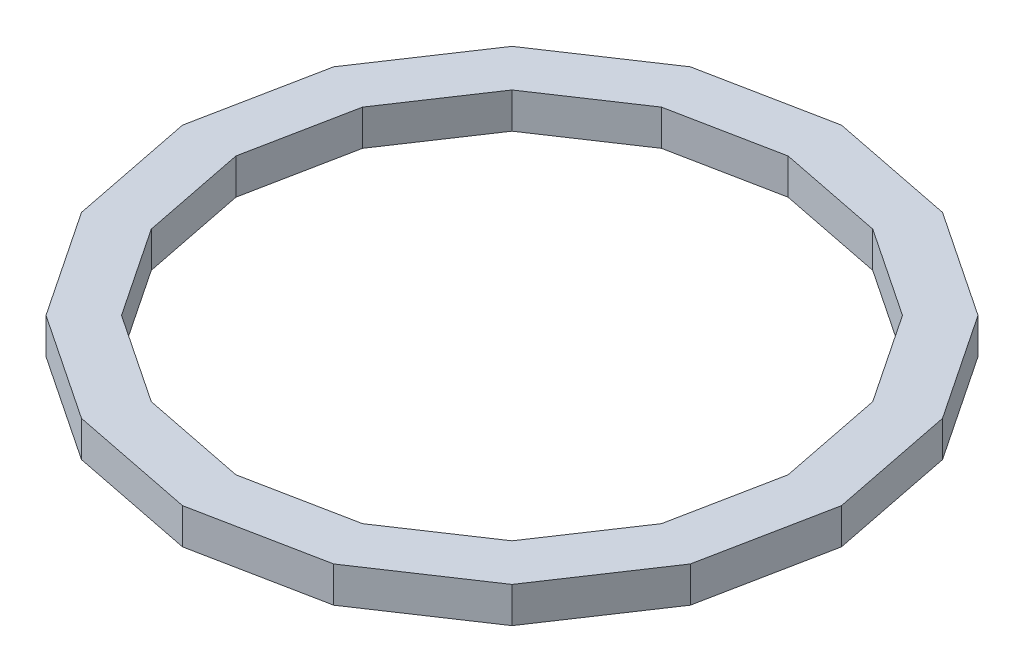
ISO-10303-21;
HEADER;
FILE_DESCRIPTION(('STEP AP214'),'2;1');
FILE_NAME('part.step','',(''),(''),'','','');
FILE_SCHEMA(('AUTOMOTIVE_DESIGN { 1 0 10303 214 1 1 1 1 }'));
ENDSEC;
DATA;
#1=APPLICATION_CONTEXT('core data for automotive mechanical design processes');
#2=APPLICATION_PROTOCOL_DEFINITION('international standard','automotive_design',2000,#1);
#3=PRODUCT_CONTEXT('',#1,'mechanical');
#4=PRODUCT('Part','Part','',(#3));
#5=PRODUCT_RELATED_PRODUCT_CATEGORY('part','',(#4));
#6=PRODUCT_DEFINITION_FORMATION('','',#4);
#7=PRODUCT_DEFINITION_CONTEXT('part definition',#1,'design');
#8=PRODUCT_DEFINITION('design','',#6,#7);
#9=PRODUCT_DEFINITION_SHAPE('','',#8);
#10=(LENGTH_UNIT() NAMED_UNIT(*) SI_UNIT(.MILLI.,.METRE.));
#11=(NAMED_UNIT(*) PLANE_ANGLE_UNIT() SI_UNIT($,.RADIAN.));
#12=(NAMED_UNIT(*) SI_UNIT($,.STERADIAN.) SOLID_ANGLE_UNIT());
#13=UNCERTAINTY_MEASURE_WITH_UNIT(LENGTH_MEASURE(1.E-05),#10,'distance_accuracy_value','');
#14=(GEOMETRIC_REPRESENTATION_CONTEXT(3) GLOBAL_UNCERTAINTY_ASSIGNED_CONTEXT((#13)) GLOBAL_UNIT_ASSIGNED_CONTEXT((#10,
#11,#12)) REPRESENTATION_CONTEXT('',''));
#15=CARTESIAN_POINT('',(0.,0.,0.));
#16=DIRECTION('',(0.,0.,1.));
#17=DIRECTION('',(1.,0.,0.));
#18=AXIS2_PLACEMENT_3D('',#15,#16,#17);
#19=CARTESIAN_POINT('',(0.,19.05,0.));
#20=DIRECTION('',(0.,1.,0.));
#21=DIRECTION('',(0.,0.,1.));
#22=AXIS2_PLACEMENT_3D('',#19,#20,#21);
#23=PLANE('',#22);
#24=DIRECTION('',(0.195090322016117,0.,-0.980785280403233));
#25=VECTOR('',#24,1.);
#26=CARTESIAN_POINT('',(162.385447122247,19.05,67.2622545300519));
#27=LINE('',#26,#25);
#28=CARTESIAN_POINT('',(162.385447122247,19.05,67.2622545300519));
#29=VERTEX_POINT('',#28);
#30=CARTESIAN_POINT('',(175.764741406113,19.05,-1.95677199495059E-12));
#31=VERTEX_POINT('',#30);
#32=EDGE_CURVE('E380',#29,#31,#27,.T.);
#33=ORIENTED_EDGE('',*,*,#32,.T.);
#34=DIRECTION('',(-0.195090322016139,0.,-0.980785280403228));
#35=VECTOR('',#34,1.);
#36=CARTESIAN_POINT('',(175.764741406113,19.05,-1.95677199495059E-12));
#37=LINE('',#36,#35);
#38=CARTESIAN_POINT('',(162.385447122246,19.05,-67.2622545300554));
#39=VERTEX_POINT('',#38);
#40=EDGE_CURVE('E384',#31,#39,#37,.T.);
#41=ORIENTED_EDGE('',*,*,#40,.T.);
#42=DIRECTION('',(-0.555570233019611,0.,-0.831469612302539));
#43=VECTOR('',#42,1.);
#44=CARTESIAN_POINT('',(162.385447122246,19.05,-67.2622545300554));
#45=LINE('',#44,#43);
#46=CARTESIAN_POINT('',(124.284440541761,19.05,-124.284440541764));
#47=VERTEX_POINT('',#46);
#48=EDGE_CURVE('E388',#39,#47,#45,.T.);
#49=ORIENTED_EDGE('',*,*,#48,.T.);
#50=DIRECTION('',(-0.831469612302552,0.,-0.555570233019593));
#51=VECTOR('',#50,1.);
#52=CARTESIAN_POINT('',(124.284440541761,19.05,-124.284440541764));
#53=LINE('',#52,#51);
#54=CARTESIAN_POINT('',(67.2622545300517,19.05,-162.385447122247));
#55=VERTEX_POINT('',#54);
#56=EDGE_CURVE('E390',#47,#55,#53,.T.);
#57=ORIENTED_EDGE('',*,*,#56,.T.);
#58=DIRECTION('',(-0.980785280403233,0.,-0.195090322016117));
#59=VECTOR('',#58,1.);
#60=CARTESIAN_POINT('',(67.2622545300517,19.05,-162.385447122247));
#61=LINE('',#60,#59);
#62=CARTESIAN_POINT('',(-1.95148982115408E-12,19.05,-175.764741406113));
#63=VERTEX_POINT('',#62);
#64=EDGE_CURVE('E393',#55,#63,#61,.T.);
#65=ORIENTED_EDGE('',*,*,#64,.T.);
#66=DIRECTION('',(-0.980785280403228,0.,0.195090322016139));
#67=VECTOR('',#66,1.);
#68=CARTESIAN_POINT('',(-1.95148982115408E-12,19.05,-175.764741406113));
#69=LINE('',#68,#67);
#70=CARTESIAN_POINT('',(-67.2622545300555,19.05,-162.385447122246));
#71=VERTEX_POINT('',#70);
#72=EDGE_CURVE('E395',#63,#71,#69,.T.);
#73=ORIENTED_EDGE('',*,*,#72,.T.);
#74=DIRECTION('',(-0.831469612302539,0.,0.555570233019612));
#75=VECTOR('',#74,1.);
#76=CARTESIAN_POINT('',(-67.2622545300555,19.05,-162.385447122246));
#77=LINE('',#76,#75);
#78=CARTESIAN_POINT('',(-124.284440541764,19.05,-124.284440541761));
#79=VERTEX_POINT('',#78);
#80=EDGE_CURVE('E398',#71,#79,#77,.T.);
#81=ORIENTED_EDGE('',*,*,#80,.T.);
#82=DIRECTION('',(-0.555570233019593,0.,0.831469612302551));
#83=VECTOR('',#82,1.);
#84=CARTESIAN_POINT('',(-124.284440541764,19.05,-124.284440541761));
#85=LINE('',#84,#83);
#86=CARTESIAN_POINT('',(-162.385447122247,19.05,-67.2622545300518));
#87=VERTEX_POINT('',#86);
#88=EDGE_CURVE('E401',#79,#87,#85,.T.);
#89=ORIENTED_EDGE('',*,*,#88,.T.);
#90=DIRECTION('',(-0.195090322016117,0.,0.980785280403233));
#91=VECTOR('',#90,1.);
#92=CARTESIAN_POINT('',(-162.385447122247,19.05,-67.2622545300518));
#93=LINE('',#92,#91);
#94=CARTESIAN_POINT('',(-175.764741406113,19.05,1.88137646251245E-12));
#95=VERTEX_POINT('',#94);
#96=EDGE_CURVE('E404',#87,#95,#93,.T.);
#97=ORIENTED_EDGE('',*,*,#96,.T.);
#98=DIRECTION('',(0.195090322016139,0.,0.980785280403228));
#99=VECTOR('',#98,1.);
#100=CARTESIAN_POINT('',(-175.764741406113,19.05,1.88137646251245E-12));
#101=LINE('',#100,#99);
#102=CARTESIAN_POINT('',(-162.385447122246,19.05,67.2622545300554));
#103=VERTEX_POINT('',#102);
#104=EDGE_CURVE('E407',#95,#103,#101,.T.);
#105=ORIENTED_EDGE('',*,*,#104,.T.);
#106=DIRECTION('',(0.555570233019612,0.,0.831469612302539));
#107=VECTOR('',#106,1.);
#108=CARTESIAN_POINT('',(-162.385447122246,19.05,67.2622545300554));
#109=LINE('',#108,#107);
#110=CARTESIAN_POINT('',(-124.284440541761,19.05,124.284440541764));
#111=VERTEX_POINT('',#110);
#112=EDGE_CURVE('E409',#103,#111,#109,.T.);
#113=ORIENTED_EDGE('',*,*,#112,.T.);
#114=DIRECTION('',(0.831469612302551,0.,0.555570233019593));
#115=VECTOR('',#114,1.);
#116=CARTESIAN_POINT('',(-124.284440541761,19.05,124.284440541764));
#117=LINE('',#116,#115);
#118=CARTESIAN_POINT('',(-67.2622545300519,19.05,162.385447122247));
#119=VERTEX_POINT('',#118);
#120=EDGE_CURVE('E411',#111,#119,#117,.T.);
#121=ORIENTED_EDGE('',*,*,#120,.T.);
#122=DIRECTION('',(0.980785280403233,0.,0.195090322016118));
#123=VECTOR('',#122,1.);
#124=CARTESIAN_POINT('',(-67.2622545300519,19.05,162.385447122247));
#125=LINE('',#124,#123);
#126=CARTESIAN_POINT('',(1.88663849847131E-12,19.05,175.764741406113));
#127=VERTEX_POINT('',#126);
#128=EDGE_CURVE('E414',#119,#127,#125,.T.);
#129=ORIENTED_EDGE('',*,*,#128,.T.);
#130=DIRECTION('',(0.980785280403228,0.,-0.195090322016139));
#131=VECTOR('',#130,1.);
#132=CARTESIAN_POINT('',(1.88663849847131E-12,19.05,175.764741406113));
#133=LINE('',#132,#131);
#134=CARTESIAN_POINT('',(67.2622545300554,19.05,162.385447122246));
#135=VERTEX_POINT('',#134);
#136=EDGE_CURVE('E416',#127,#135,#133,.T.);
#137=ORIENTED_EDGE('',*,*,#136,.T.);
#138=DIRECTION('',(0.831469612302539,0.,-0.555570233019612));
#139=VECTOR('',#138,1.);
#140=CARTESIAN_POINT('',(67.2622545300554,19.05,162.385447122246));
#141=LINE('',#140,#139);
#142=CARTESIAN_POINT('',(124.284440541764,19.05,124.284440541761));
#143=VERTEX_POINT('',#142);
#144=EDGE_CURVE('E418',#135,#143,#141,.T.);
#145=ORIENTED_EDGE('',*,*,#144,.T.);
#146=DIRECTION('',(0.555570233019593,0.,-0.831469612302551));
#147=VECTOR('',#146,1.);
#148=CARTESIAN_POINT('',(124.284440541764,19.05,124.284440541761));
#149=LINE('',#148,#147);
#150=EDGE_CURVE('E421',#143,#29,#149,.T.);
#151=ORIENTED_EDGE('',*,*,#150,.T.);
#152=EDGE_LOOP('',(#33,#41,#49,#57,#65,#73,#81,#89,#97,#105,#113,#121,#129,#137,#145,#151));
#153=FACE_BOUND('',#152,.T.);
#154=DIRECTION('',(-0.195090322016139,0.,-0.980785280403228));
#155=VECTOR('',#154,1.);
#156=CARTESIAN_POINT('',(147.277364445772,19.05,-1.77188747892797E-12));
#157=LINE('',#156,#155);
#158=CARTESIAN_POINT('',(147.277364445772,19.05,-1.77188747892797E-12));
#159=VERTEX_POINT('',#158);
#160=CARTESIAN_POINT('',(136.066542613654,19.05,-56.3606073357939));
#161=VERTEX_POINT('',#160);
#162=EDGE_CURVE('E252',#159,#161,#157,.T.);
#163=ORIENTED_EDGE('',*,*,#162,.F.);
#164=DIRECTION('',(0.195090322016117,0.,-0.980785280403233));
#165=VECTOR('',#164,1.);
#166=CARTESIAN_POINT('',(136.066542613655,19.05,56.3606073357909));
#167=LINE('',#166,#165);
#168=CARTESIAN_POINT('',(136.066542613655,19.05,56.3606073357909));
#169=VERTEX_POINT('',#168);
#170=EDGE_CURVE('E243',#169,#159,#167,.T.);
#171=ORIENTED_EDGE('',*,*,#170,.F.);
#172=DIRECTION('',(0.555570233019593,0.,-0.831469612302552));
#173=VECTOR('',#172,1.);
#174=CARTESIAN_POINT('',(104.140823114889,19.05,104.140823114887));
#175=LINE('',#174,#173);
#176=CARTESIAN_POINT('',(104.140823114889,19.05,104.140823114887));
#177=VERTEX_POINT('',#176);
#178=EDGE_CURVE('E300',#177,#169,#175,.T.);
#179=ORIENTED_EDGE('',*,*,#178,.F.);
#180=DIRECTION('',(0.831469612302539,0.,-0.555570233019611));
#181=VECTOR('',#180,1.);
#182=CARTESIAN_POINT('',(56.3606073357939,19.05,136.066542613654));
#183=LINE('',#182,#181);
#184=CARTESIAN_POINT('',(56.3606073357939,19.05,136.066542613654));
#185=VERTEX_POINT('',#184);
#186=EDGE_CURVE('E298',#185,#177,#183,.T.);
#187=ORIENTED_EDGE('',*,*,#186,.F.);
#188=DIRECTION('',(0.980785280403228,0.,-0.19509032201614));
#189=VECTOR('',#188,1.);
#190=CARTESIAN_POINT('',(1.68287399658217E-12,19.05,147.277364445772));
#191=LINE('',#190,#189);
#192=CARTESIAN_POINT('',(1.68287399658217E-12,19.05,147.277364445772));
#193=VERTEX_POINT('',#192);
#194=EDGE_CURVE('E296',#193,#185,#191,.T.);
#195=ORIENTED_EDGE('',*,*,#194,.F.);
#196=DIRECTION('',(0.980785280403233,0.,0.195090322016117));
#197=VECTOR('',#196,1.);
#198=CARTESIAN_POINT('',(-56.3606073357909,19.05,136.066542613655));
#199=LINE('',#198,#197);
#200=CARTESIAN_POINT('',(-56.3606073357909,19.05,136.066542613655));
#201=VERTEX_POINT('',#200);
#202=EDGE_CURVE('E294',#201,#193,#199,.T.);
#203=ORIENTED_EDGE('',*,*,#202,.F.);
#204=DIRECTION('',(0.831469612302551,0.,0.555570233019593));
#205=VECTOR('',#204,1.);
#206=CARTESIAN_POINT('',(-104.140823114887,19.05,104.140823114889));
#207=LINE('',#206,#205);
#208=CARTESIAN_POINT('',(-104.140823114887,19.05,104.140823114889));
#209=VERTEX_POINT('',#208);
#210=EDGE_CURVE('E292',#209,#201,#207,.T.);
#211=ORIENTED_EDGE('',*,*,#210,.F.);
#212=DIRECTION('',(0.555570233019612,0.,0.831469612302539));
#213=VECTOR('',#212,1.);
#214=CARTESIAN_POINT('',(-136.066542613654,19.05,56.3606073357939));
#215=LINE('',#214,#213);
#216=CARTESIAN_POINT('',(-136.066542613654,19.05,56.3606073357939));
#217=VERTEX_POINT('',#216);
#218=EDGE_CURVE('E290',#217,#209,#215,.T.);
#219=ORIENTED_EDGE('',*,*,#218,.F.);
#220=DIRECTION('',(0.195090322016139,0.,0.980785280403228));
#221=VECTOR('',#220,1.);
#222=CARTESIAN_POINT('',(-147.277364445772,19.05,1.6751924184933E-12));
#223=LINE('',#222,#221);
#224=CARTESIAN_POINT('',(-147.277364445772,19.05,1.6751924184933E-12));
#225=VERTEX_POINT('',#224);
#226=EDGE_CURVE('E288',#225,#217,#223,.T.);
#227=ORIENTED_EDGE('',*,*,#226,.F.);
#228=DIRECTION('',(-0.195090322016117,0.,0.980785280403233));
#229=VECTOR('',#228,1.);
#230=CARTESIAN_POINT('',(-136.066542613655,19.05,-56.3606073357908));
#231=LINE('',#230,#229);
#232=CARTESIAN_POINT('',(-136.066542613655,19.05,-56.3606073357908));
#233=VERTEX_POINT('',#232);
#234=EDGE_CURVE('E286',#233,#225,#231,.T.);
#235=ORIENTED_EDGE('',*,*,#234,.F.);
#236=DIRECTION('',(-0.555570233019593,0.,0.831469612302552));
#237=VECTOR('',#236,1.);
#238=CARTESIAN_POINT('',(-104.140823114889,19.05,-104.140823114887));
#239=LINE('',#238,#237);
#240=CARTESIAN_POINT('',(-104.140823114889,19.05,-104.140823114887));
#241=VERTEX_POINT('',#240);
#242=EDGE_CURVE('E283',#241,#233,#239,.T.);
#243=ORIENTED_EDGE('',*,*,#242,.F.);
#244=DIRECTION('',(-0.831469612302539,0.,0.555570233019612));
#245=VECTOR('',#244,1.);
#246=CARTESIAN_POINT('',(-56.3606073357939,19.05,-136.066542613654));
#247=LINE('',#246,#245);
#248=CARTESIAN_POINT('',(-56.3606073357939,19.05,-136.066542613654));
#249=VERTEX_POINT('',#248);
#250=EDGE_CURVE('E280',#249,#241,#247,.T.);
#251=ORIENTED_EDGE('',*,*,#250,.F.);
#252=DIRECTION('',(-0.980785280403228,0.,0.195090322016139));
#253=VECTOR('',#252,1.);
#254=CARTESIAN_POINT('',(-1.70092994275236E-12,19.05,-147.277364445772));
#255=LINE('',#254,#253);
#256=CARTESIAN_POINT('',(-1.70092994275236E-12,19.05,-147.277364445772));
#257=VERTEX_POINT('',#256);
#258=EDGE_CURVE('E278',#257,#249,#255,.T.);
#259=ORIENTED_EDGE('',*,*,#258,.F.);
#260=DIRECTION('',(-0.980785280403233,0.,-0.195090322016117));
#261=VECTOR('',#260,1.);
#262=CARTESIAN_POINT('',(56.360607335791,19.05,-136.066542613655));
#263=LINE('',#262,#261);
#264=CARTESIAN_POINT('',(56.360607335791,19.05,-136.066542613655));
#265=VERTEX_POINT('',#264);
#266=EDGE_CURVE('E275',#265,#257,#263,.T.);
#267=ORIENTED_EDGE('',*,*,#266,.F.);
#268=DIRECTION('',(-0.831469612302552,0.,-0.555570233019592));
#269=VECTOR('',#268,1.);
#270=CARTESIAN_POINT('',(104.140823114887,19.05,-104.140823114889));
#271=LINE('',#270,#269);
#272=CARTESIAN_POINT('',(104.140823114887,19.05,-104.140823114889));
#273=VERTEX_POINT('',#272);
#274=EDGE_CURVE('E271',#273,#265,#271,.T.);
#275=ORIENTED_EDGE('',*,*,#274,.F.);
#276=DIRECTION('',(-0.555570233019612,0.,-0.831469612302539));
#277=VECTOR('',#276,1.);
#278=CARTESIAN_POINT('',(136.066542613654,19.05,-56.3606073357939));
#279=LINE('',#278,#277);
#280=EDGE_CURVE('E265',#161,#273,#279,.T.);
#281=ORIENTED_EDGE('',*,*,#280,.F.);
#282=EDGE_LOOP('',(#163,#171,#179,#187,#195,#203,#211,#219,#227,#235,#243,#251,#259,#267,#275,#281));
#283=FACE_BOUND('',#282,.T.);
#284=ADVANCED_FACE('F34',(#153,#283),#23,.T.);
#285=CARTESIAN_POINT('',(0.,0.,0.));
#286=DIRECTION('',(0.,1.,0.));
#287=DIRECTION('',(0.,0.,1.));
#288=AXIS2_PLACEMENT_3D('',#285,#286,#287);
#289=PLANE('',#288);
#290=DIRECTION('',(0.195090322016117,0.,-0.980785280403233));
#291=VECTOR('',#290,1.);
#292=CARTESIAN_POINT('',(162.385447122247,0.,67.2622545300519));
#293=LINE('',#292,#291);
#294=CARTESIAN_POINT('',(162.385447122247,0.,67.2622545300519));
#295=VERTEX_POINT('',#294);
#296=CARTESIAN_POINT('',(175.764741406113,0.,-1.95677199495059E-12));
#297=VERTEX_POINT('',#296);
#298=EDGE_CURVE('E260',#295,#297,#293,.T.);
#299=ORIENTED_EDGE('',*,*,#298,.F.);
#300=DIRECTION('',(0.555570233019593,0.,-0.831469612302551));
#301=VECTOR('',#300,1.);
#302=CARTESIAN_POINT('',(124.284440541764,0.,124.284440541761));
#303=LINE('',#302,#301);
#304=CARTESIAN_POINT('',(124.284440541764,0.,124.284440541761));
#305=VERTEX_POINT('',#304);
#306=EDGE_CURVE('E385',#305,#295,#303,.T.);
#307=ORIENTED_EDGE('',*,*,#306,.F.);
#308=DIRECTION('',(0.831469612302539,0.,-0.555570233019612));
#309=VECTOR('',#308,1.);
#310=CARTESIAN_POINT('',(67.2622545300554,0.,162.385447122246));
#311=LINE('',#310,#309);
#312=CARTESIAN_POINT('',(67.2622545300554,0.,162.385447122246));
#313=VERTEX_POINT('',#312);
#314=EDGE_CURVE('E457',#313,#305,#311,.T.);
#315=ORIENTED_EDGE('',*,*,#314,.F.);
#316=DIRECTION('',(0.980785280403228,0.,-0.195090322016139));
#317=VECTOR('',#316,1.);
#318=CARTESIAN_POINT('',(1.88663849847131E-12,0.,175.764741406113));
#319=LINE('',#318,#317);
#320=CARTESIAN_POINT('',(1.88663849847131E-12,0.,175.764741406113));
#321=VERTEX_POINT('',#320);
#322=EDGE_CURVE('E455',#321,#313,#319,.T.);
#323=ORIENTED_EDGE('',*,*,#322,.F.);
#324=DIRECTION('',(0.980785280403233,0.,0.195090322016118));
#325=VECTOR('',#324,1.);
#326=CARTESIAN_POINT('',(-67.2622545300519,0.,162.385447122247));
#327=LINE('',#326,#325);
#328=CARTESIAN_POINT('',(-67.2622545300519,0.,162.385447122247));
#329=VERTEX_POINT('',#328);
#330=EDGE_CURVE('E452',#329,#321,#327,.T.);
#331=ORIENTED_EDGE('',*,*,#330,.F.);
#332=DIRECTION('',(0.831469612302551,0.,0.555570233019593));
#333=VECTOR('',#332,1.);
#334=CARTESIAN_POINT('',(-124.284440541761,0.,124.284440541764));
#335=LINE('',#334,#333);
#336=CARTESIAN_POINT('',(-124.284440541761,0.,124.284440541764));
#337=VERTEX_POINT('',#336);
#338=EDGE_CURVE('E449',#337,#329,#335,.T.);
#339=ORIENTED_EDGE('',*,*,#338,.F.);
#340=DIRECTION('',(0.555570233019612,0.,0.831469612302539));
#341=VECTOR('',#340,1.);
#342=CARTESIAN_POINT('',(-162.385447122246,0.,67.2622545300554));
#343=LINE('',#342,#341);
#344=CARTESIAN_POINT('',(-162.385447122246,0.,67.2622545300554));
#345=VERTEX_POINT('',#344);
#346=EDGE_CURVE('E446',#345,#337,#343,.T.);
#347=ORIENTED_EDGE('',*,*,#346,.F.);
#348=DIRECTION('',(0.195090322016139,0.,0.980785280403228));
#349=VECTOR('',#348,1.);
#350=CARTESIAN_POINT('',(-175.764741406113,0.,1.88137646251245E-12));
#351=LINE('',#350,#349);
#352=CARTESIAN_POINT('',(-175.764741406113,0.,1.88137646251245E-12));
#353=VERTEX_POINT('',#352);
#354=EDGE_CURVE('E444',#353,#345,#351,.T.);
#355=ORIENTED_EDGE('',*,*,#354,.F.);
#356=DIRECTION('',(-0.195090322016117,0.,0.980785280403233));
#357=VECTOR('',#356,1.);
#358=CARTESIAN_POINT('',(-162.385447122247,0.,-67.2622545300518));
#359=LINE('',#358,#357);
#360=CARTESIAN_POINT('',(-162.385447122247,0.,-67.2622545300518));
#361=VERTEX_POINT('',#360);
#362=EDGE_CURVE('E442',#361,#353,#359,.T.);
#363=ORIENTED_EDGE('',*,*,#362,.F.);
#364=DIRECTION('',(-0.555570233019593,0.,0.831469612302551));
#365=VECTOR('',#364,1.);
#366=CARTESIAN_POINT('',(-124.284440541764,0.,-124.284440541761));
#367=LINE('',#366,#365);
#368=CARTESIAN_POINT('',(-124.284440541764,0.,-124.284440541761));
#369=VERTEX_POINT('',#368);
#370=EDGE_CURVE('E439',#369,#361,#367,.T.);
#371=ORIENTED_EDGE('',*,*,#370,.F.);
#372=DIRECTION('',(-0.831469612302539,0.,0.555570233019612));
#373=VECTOR('',#372,1.);
#374=CARTESIAN_POINT('',(-67.2622545300555,0.,-162.385447122246));
#375=LINE('',#374,#373);
#376=CARTESIAN_POINT('',(-67.2622545300555,0.,-162.385447122246));
#377=VERTEX_POINT('',#376);
#378=EDGE_CURVE('E437',#377,#369,#375,.T.);
#379=ORIENTED_EDGE('',*,*,#378,.F.);
#380=DIRECTION('',(-0.980785280403228,0.,0.195090322016139));
#381=VECTOR('',#380,1.);
#382=CARTESIAN_POINT('',(-1.95148982115408E-12,0.,-175.764741406113));
#383=LINE('',#382,#381);
#384=CARTESIAN_POINT('',(-1.95148982115408E-12,0.,-175.764741406113));
#385=VERTEX_POINT('',#384);
#386=EDGE_CURVE('E435',#385,#377,#383,.T.);
#387=ORIENTED_EDGE('',*,*,#386,.F.);
#388=DIRECTION('',(-0.980785280403233,0.,-0.195090322016117));
#389=VECTOR('',#388,1.);
#390=CARTESIAN_POINT('',(67.2622545300517,0.,-162.385447122247));
#391=LINE('',#390,#389);
#392=CARTESIAN_POINT('',(67.2622545300517,0.,-162.385447122247));
#393=VERTEX_POINT('',#392);
#394=EDGE_CURVE('E433',#393,#385,#391,.T.);
#395=ORIENTED_EDGE('',*,*,#394,.F.);
#396=DIRECTION('',(-0.831469612302552,0.,-0.555570233019593));
#397=VECTOR('',#396,1.);
#398=CARTESIAN_POINT('',(124.284440541761,0.,-124.284440541764));
#399=LINE('',#398,#397);
#400=CARTESIAN_POINT('',(124.284440541761,0.,-124.284440541764));
#401=VERTEX_POINT('',#400);
#402=EDGE_CURVE('E431',#401,#393,#399,.T.);
#403=ORIENTED_EDGE('',*,*,#402,.F.);
#404=DIRECTION('',(-0.555570233019611,0.,-0.831469612302539));
#405=VECTOR('',#404,1.);
#406=CARTESIAN_POINT('',(162.385447122246,0.,-67.2622545300554));
#407=LINE('',#406,#405);
#408=CARTESIAN_POINT('',(162.385447122246,0.,-67.2622545300554));
#409=VERTEX_POINT('',#408);
#410=EDGE_CURVE('E428',#409,#401,#407,.T.);
#411=ORIENTED_EDGE('',*,*,#410,.F.);
#412=DIRECTION('',(-0.195090322016139,0.,-0.980785280403228));
#413=VECTOR('',#412,1.);
#414=CARTESIAN_POINT('',(175.764741406113,0.,-1.95677199495059E-12));
#415=LINE('',#414,#413);
#416=EDGE_CURVE('E426',#297,#409,#415,.T.);
#417=ORIENTED_EDGE('',*,*,#416,.F.);
#418=EDGE_LOOP('',(#299,#307,#315,#323,#331,#339,#347,#355,#363,#371,#379,#387,#395,#403,#411,#417));
#419=FACE_BOUND('',#418,.T.);
#420=DIRECTION('',(0.195090322016117,0.,-0.980785280403233));
#421=VECTOR('',#420,1.);
#422=CARTESIAN_POINT('',(136.066542613655,0.,56.3606073357909));
#423=LINE('',#422,#421);
#424=CARTESIAN_POINT('',(136.066542613655,0.,56.3606073357909));
#425=VERTEX_POINT('',#424);
#426=CARTESIAN_POINT('',(147.277364445772,0.,-1.77188747892797E-12));
#427=VERTEX_POINT('',#426);
#428=EDGE_CURVE('E57',#425,#427,#423,.T.);
#429=ORIENTED_EDGE('',*,*,#428,.T.);
#430=DIRECTION('',(-0.195090322016139,0.,-0.980785280403228));
#431=VECTOR('',#430,1.);
#432=CARTESIAN_POINT('',(147.277364445772,0.,-1.77188747892797E-12));
#433=LINE('',#432,#431);
#434=CARTESIAN_POINT('',(136.066542613654,0.,-56.3606073357939));
#435=VERTEX_POINT('',#434);
#436=EDGE_CURVE('E259',#427,#435,#433,.T.);
#437=ORIENTED_EDGE('',*,*,#436,.T.);
#438=DIRECTION('',(-0.555570233019612,0.,-0.831469612302539));
#439=VECTOR('',#438,1.);
#440=CARTESIAN_POINT('',(136.066542613654,0.,-56.3606073357939));
#441=LINE('',#440,#439);
#442=CARTESIAN_POINT('',(104.140823114887,0.,-104.140823114889));
#443=VERTEX_POINT('',#442);
#444=EDGE_CURVE('E306',#435,#443,#441,.T.);
#445=ORIENTED_EDGE('',*,*,#444,.T.);
#446=DIRECTION('',(-0.831469612302552,0.,-0.555570233019592));
#447=VECTOR('',#446,1.);
#448=CARTESIAN_POINT('',(104.140823114887,0.,-104.140823114889));
#449=LINE('',#448,#447);
#450=CARTESIAN_POINT('',(56.360607335791,0.,-136.066542613655));
#451=VERTEX_POINT('',#450);
#452=EDGE_CURVE('E310',#443,#451,#449,.T.);
#453=ORIENTED_EDGE('',*,*,#452,.T.);
#454=DIRECTION('',(-0.980785280403233,0.,-0.195090322016117));
#455=VECTOR('',#454,1.);
#456=CARTESIAN_POINT('',(56.360607335791,0.,-136.066542613655));
#457=LINE('',#456,#455);
#458=CARTESIAN_POINT('',(-1.70092994275236E-12,0.,-147.277364445772));
#459=VERTEX_POINT('',#458);
#460=EDGE_CURVE('E313',#451,#459,#457,.T.);
#461=ORIENTED_EDGE('',*,*,#460,.T.);
#462=DIRECTION('',(-0.980785280403228,0.,0.195090322016139));
#463=VECTOR('',#462,1.);
#464=CARTESIAN_POINT('',(-1.70092994275236E-12,0.,-147.277364445772));
#465=LINE('',#464,#463);
#466=CARTESIAN_POINT('',(-56.3606073357939,0.,-136.066542613654));
#467=VERTEX_POINT('',#466);
#468=EDGE_CURVE('E316',#459,#467,#465,.T.);
#469=ORIENTED_EDGE('',*,*,#468,.T.);
#470=DIRECTION('',(-0.831469612302539,0.,0.555570233019612));
#471=VECTOR('',#470,1.);
#472=CARTESIAN_POINT('',(-56.3606073357939,0.,-136.066542613654));
#473=LINE('',#472,#471);
#474=CARTESIAN_POINT('',(-104.140823114889,0.,-104.140823114887));
#475=VERTEX_POINT('',#474);
#476=EDGE_CURVE('E320',#467,#475,#473,.T.);
#477=ORIENTED_EDGE('',*,*,#476,.T.);
#478=DIRECTION('',(-0.555570233019593,0.,0.831469612302552));
#479=VECTOR('',#478,1.);
#480=CARTESIAN_POINT('',(-104.140823114889,0.,-104.140823114887));
#481=LINE('',#480,#479);
#482=CARTESIAN_POINT('',(-136.066542613655,0.,-56.3606073357908));
#483=VERTEX_POINT('',#482);
#484=EDGE_CURVE('E323',#475,#483,#481,.T.);
#485=ORIENTED_EDGE('',*,*,#484,.T.);
#486=DIRECTION('',(-0.195090322016117,0.,0.980785280403233));
#487=VECTOR('',#486,1.);
#488=CARTESIAN_POINT('',(-136.066542613655,0.,-56.3606073357908));
#489=LINE('',#488,#487);
#490=CARTESIAN_POINT('',(-147.277364445772,0.,1.6751924184933E-12));
#491=VERTEX_POINT('',#490);
#492=EDGE_CURVE('E327',#483,#491,#489,.T.);
#493=ORIENTED_EDGE('',*,*,#492,.T.);
#494=DIRECTION('',(0.195090322016139,0.,0.980785280403228));
#495=VECTOR('',#494,1.);
#496=CARTESIAN_POINT('',(-147.277364445772,0.,1.6751924184933E-12));
#497=LINE('',#496,#495);
#498=CARTESIAN_POINT('',(-136.066542613654,0.,56.3606073357939));
#499=VERTEX_POINT('',#498);
#500=EDGE_CURVE('E330',#491,#499,#497,.T.);
#501=ORIENTED_EDGE('',*,*,#500,.T.);
#502=DIRECTION('',(0.555570233019612,0.,0.831469612302539));
#503=VECTOR('',#502,1.);
#504=CARTESIAN_POINT('',(-136.066542613654,0.,56.3606073357939));
#505=LINE('',#504,#503);
#506=CARTESIAN_POINT('',(-104.140823114887,0.,104.140823114889));
#507=VERTEX_POINT('',#506);
#508=EDGE_CURVE('E333',#499,#507,#505,.T.);
#509=ORIENTED_EDGE('',*,*,#508,.T.);
#510=DIRECTION('',(0.831469612302551,0.,0.555570233019593));
#511=VECTOR('',#510,1.);
#512=CARTESIAN_POINT('',(-104.140823114887,0.,104.140823114889));
#513=LINE('',#512,#511);
#514=CARTESIAN_POINT('',(-56.3606073357909,0.,136.066542613655));
#515=VERTEX_POINT('',#514);
#516=EDGE_CURVE('E336',#507,#515,#513,.T.);
#517=ORIENTED_EDGE('',*,*,#516,.T.);
#518=DIRECTION('',(0.980785280403233,0.,0.195090322016117));
#519=VECTOR('',#518,1.);
#520=CARTESIAN_POINT('',(-56.3606073357909,0.,136.066542613655));
#521=LINE('',#520,#519);
#522=CARTESIAN_POINT('',(1.68287399658217E-12,0.,147.277364445772));
#523=VERTEX_POINT('',#522);
#524=EDGE_CURVE('E339',#515,#523,#521,.T.);
#525=ORIENTED_EDGE('',*,*,#524,.T.);
#526=DIRECTION('',(0.980785280403228,0.,-0.19509032201614));
#527=VECTOR('',#526,1.);
#528=CARTESIAN_POINT('',(1.68287399658217E-12,0.,147.277364445772));
#529=LINE('',#528,#527);
#530=CARTESIAN_POINT('',(56.3606073357939,0.,136.066542613654));
#531=VERTEX_POINT('',#530);
#532=EDGE_CURVE('E342',#523,#531,#529,.T.);
#533=ORIENTED_EDGE('',*,*,#532,.T.);
#534=DIRECTION('',(0.831469612302539,0.,-0.555570233019611));
#535=VECTOR('',#534,1.);
#536=CARTESIAN_POINT('',(56.3606073357939,0.,136.066542613654));
#537=LINE('',#536,#535);
#538=CARTESIAN_POINT('',(104.140823114889,0.,104.140823114887));
#539=VERTEX_POINT('',#538);
#540=EDGE_CURVE('E345',#531,#539,#537,.T.);
#541=ORIENTED_EDGE('',*,*,#540,.T.);
#542=DIRECTION('',(0.555570233019593,0.,-0.831469612302552));
#543=VECTOR('',#542,1.);
#544=CARTESIAN_POINT('',(104.140823114889,0.,104.140823114887));
#545=LINE('',#544,#543);
#546=EDGE_CURVE('E253',#539,#425,#545,.T.);
#547=ORIENTED_EDGE('',*,*,#546,.T.);
#548=EDGE_LOOP('',(#429,#437,#445,#453,#461,#469,#477,#485,#493,#501,#509,#517,#525,#533,#541,#547));
#549=FACE_BOUND('',#548,.T.);
#550=ADVANCED_FACE('F516',(#419,#549),#289,.F.);
#551=CARTESIAN_POINT('',(162.385447122247,19.05,67.2622545300519));
#552=DIRECTION('',(-0.980785280403233,0.,-0.195090322016117));
#553=DIRECTION('',(-0.195090322016118,0.,0.980785280403233));
#554=AXIS2_PLACEMENT_3D('',#551,#552,#553);
#555=PLANE('',#554);
#556=ORIENTED_EDGE('',*,*,#298,.T.);
#557=DIRECTION('',(0.,-1.,0.));
#558=VECTOR('',#557,1.);
#559=CARTESIAN_POINT('',(175.764741406113,19.05,-1.95677199495059E-12));
#560=LINE('',#559,#558);
#561=EDGE_CURVE('E11',#31,#297,#560,.T.);
#562=ORIENTED_EDGE('',*,*,#561,.F.);
#563=ORIENTED_EDGE('',*,*,#32,.F.);
#564=DIRECTION('',(0.,-1.,0.));
#565=VECTOR('',#564,1.);
#566=CARTESIAN_POINT('',(162.385447122247,19.05,67.2622545300519));
#567=LINE('',#566,#565);
#568=EDGE_CURVE('E423',#29,#295,#567,.T.);
#569=ORIENTED_EDGE('',*,*,#568,.T.);
#570=EDGE_LOOP('',(#556,#562,#563,#569));
#571=FACE_BOUND('',#570,.T.);
#572=ADVANCED_FACE('F36',(#571),#555,.F.);
#573=CARTESIAN_POINT('',(175.764741406113,19.05,-1.95677199495059E-12));
#574=DIRECTION('',(-0.980785280403228,0.,0.195090322016139));
#575=DIRECTION('',(0.195090322016139,0.,0.980785280403228));
#576=AXIS2_PLACEMENT_3D('',#573,#574,#575);
#577=PLANE('',#576);
#578=ORIENTED_EDGE('',*,*,#416,.T.);
#579=DIRECTION('',(0.,-1.,0.));
#580=VECTOR('',#579,1.);
#581=CARTESIAN_POINT('',(162.385447122246,19.05,-67.2622545300554));
#582=LINE('',#581,#580);
#583=EDGE_CURVE('E42',#39,#409,#582,.T.);
#584=ORIENTED_EDGE('',*,*,#583,.F.);
#585=ORIENTED_EDGE('',*,*,#40,.F.);
#586=ORIENTED_EDGE('',*,*,#561,.T.);
#587=EDGE_LOOP('',(#578,#584,#585,#586));
#588=FACE_BOUND('',#587,.T.);
#589=ADVANCED_FACE('F533',(#588),#577,.F.);
#590=CARTESIAN_POINT('',(162.385447122246,19.05,-67.2622545300554));
#591=DIRECTION('',(-0.831469612302539,0.,0.555570233019611));
#592=DIRECTION('',(0.555570233019611,0.,0.831469612302539));
#593=AXIS2_PLACEMENT_3D('',#590,#591,#592);
#594=PLANE('',#593);
#595=ORIENTED_EDGE('',*,*,#410,.T.);
#596=DIRECTION('',(0.,-1.,0.));
#597=VECTOR('',#596,1.);
#598=CARTESIAN_POINT('',(124.284440541761,19.05,-124.284440541764));
#599=LINE('',#598,#597);
#600=EDGE_CURVE('E503',#47,#401,#599,.T.);
#601=ORIENTED_EDGE('',*,*,#600,.F.);
#602=ORIENTED_EDGE('',*,*,#48,.F.);
#603=ORIENTED_EDGE('',*,*,#583,.T.);
#604=EDGE_LOOP('',(#595,#601,#602,#603));
#605=FACE_BOUND('',#604,.T.);
#606=ADVANCED_FACE('F510',(#605),#594,.F.);
#607=CARTESIAN_POINT('',(124.284440541761,19.05,-124.284440541764));
#608=DIRECTION('',(-0.555570233019593,0.,0.831469612302551));
#609=DIRECTION('',(0.831469612302551,0.,0.555570233019593));
#610=AXIS2_PLACEMENT_3D('',#607,#608,#609);
#611=PLANE('',#610);
#612=ORIENTED_EDGE('',*,*,#402,.T.);
#613=DIRECTION('',(0.,-1.,0.));
#614=VECTOR('',#613,1.);
#615=CARTESIAN_POINT('',(67.2622545300517,19.05,-162.385447122247));
#616=LINE('',#615,#614);
#617=EDGE_CURVE('E500',#55,#393,#616,.T.);
#618=ORIENTED_EDGE('',*,*,#617,.F.);
#619=ORIENTED_EDGE('',*,*,#56,.F.);
#620=ORIENTED_EDGE('',*,*,#600,.T.);
#621=EDGE_LOOP('',(#612,#618,#619,#620));
#622=FACE_BOUND('',#621,.T.);
#623=ADVANCED_FACE('F522',(#622),#611,.F.);
#624=CARTESIAN_POINT('',(67.2622545300517,19.05,-162.385447122247));
#625=DIRECTION('',(-0.195090322016117,0.,0.980785280403233));
#626=DIRECTION('',(0.980785280403233,0.,0.195090322016117));
#627=AXIS2_PLACEMENT_3D('',#624,#625,#626);
#628=PLANE('',#627);
#629=ORIENTED_EDGE('',*,*,#394,.T.);
#630=DIRECTION('',(0.,-1.,0.));
#631=VECTOR('',#630,1.);
#632=CARTESIAN_POINT('',(-1.95148982115408E-12,19.05,-175.764741406113));
#633=LINE('',#632,#631);
#634=EDGE_CURVE('E496',#63,#385,#633,.T.);
#635=ORIENTED_EDGE('',*,*,#634,.F.);
#636=ORIENTED_EDGE('',*,*,#64,.F.);
#637=ORIENTED_EDGE('',*,*,#617,.T.);
#638=EDGE_LOOP('',(#629,#635,#636,#637));
#639=FACE_BOUND('',#638,.T.);
#640=ADVANCED_FACE('F526',(#639),#628,.F.);
#641=CARTESIAN_POINT('',(-1.95148982115408E-12,19.05,-175.764741406113));
#642=DIRECTION('',(0.195090322016139,0.,0.980785280403228));
#643=DIRECTION('',(0.980785280403228,0.,-0.195090322016139));
#644=AXIS2_PLACEMENT_3D('',#641,#642,#643);
#645=PLANE('',#644);
#646=ORIENTED_EDGE('',*,*,#386,.T.);
#647=DIRECTION('',(0.,-1.,0.));
#648=VECTOR('',#647,1.);
#649=CARTESIAN_POINT('',(-67.2622545300555,19.05,-162.385447122246));
#650=LINE('',#649,#648);
#651=EDGE_CURVE('E492',#71,#377,#650,.T.);
#652=ORIENTED_EDGE('',*,*,#651,.F.);
#653=ORIENTED_EDGE('',*,*,#72,.F.);
#654=ORIENTED_EDGE('',*,*,#634,.T.);
#655=EDGE_LOOP('',(#646,#652,#653,#654));
#656=FACE_BOUND('',#655,.T.);
#657=ADVANCED_FACE('F586',(#656),#645,.F.);
#658=CARTESIAN_POINT('',(-67.2622545300555,19.05,-162.385447122246));
#659=DIRECTION('',(0.555570233019612,0.,0.831469612302539));
#660=DIRECTION('',(0.831469612302539,0.,-0.555570233019612));
#661=AXIS2_PLACEMENT_3D('',#658,#659,#660);
#662=PLANE('',#661);
#663=ORIENTED_EDGE('',*,*,#378,.T.);
#664=DIRECTION('',(0.,-1.,0.));
#665=VECTOR('',#664,1.);
#666=CARTESIAN_POINT('',(-124.284440541764,19.05,-124.284440541761));
#667=LINE('',#666,#665);
#668=EDGE_CURVE('E489',#79,#369,#667,.T.);
#669=ORIENTED_EDGE('',*,*,#668,.F.);
#670=ORIENTED_EDGE('',*,*,#80,.F.);
#671=ORIENTED_EDGE('',*,*,#651,.T.);
#672=EDGE_LOOP('',(#663,#669,#670,#671));
#673=FACE_BOUND('',#672,.T.);
#674=ADVANCED_FACE('F583',(#673),#662,.F.);
#675=CARTESIAN_POINT('',(-124.284440541764,19.05,-124.284440541761));
#676=DIRECTION('',(0.831469612302551,0.,0.555570233019593));
#677=DIRECTION('',(0.555570233019593,0.,-0.831469612302551));
#678=AXIS2_PLACEMENT_3D('',#675,#676,#677);
#679=PLANE('',#678);
#680=ORIENTED_EDGE('',*,*,#370,.T.);
#681=DIRECTION('',(0.,-1.,0.));
#682=VECTOR('',#681,1.);
#683=CARTESIAN_POINT('',(-162.385447122247,19.05,-67.2622545300518));
#684=LINE('',#683,#682);
#685=EDGE_CURVE('E485',#87,#361,#684,.T.);
#686=ORIENTED_EDGE('',*,*,#685,.F.);
#687=ORIENTED_EDGE('',*,*,#88,.F.);
#688=ORIENTED_EDGE('',*,*,#668,.T.);
#689=EDGE_LOOP('',(#680,#686,#687,#688));
#690=FACE_BOUND('',#689,.T.);
#691=ADVANCED_FACE('F579',(#690),#679,.F.);
#692=CARTESIAN_POINT('',(-162.385447122247,19.05,-67.2622545300518));
#693=DIRECTION('',(0.980785280403233,0.,0.195090322016117));
#694=DIRECTION('',(0.195090322016117,0.,-0.980785280403233));
#695=AXIS2_PLACEMENT_3D('',#692,#693,#694);
#696=PLANE('',#695);
#697=ORIENTED_EDGE('',*,*,#362,.T.);
#698=DIRECTION('',(0.,-1.,0.));
#699=VECTOR('',#698,1.);
#700=CARTESIAN_POINT('',(-175.764741406113,19.05,1.88137646251245E-12));
#701=LINE('',#700,#699);
#702=EDGE_CURVE('E482',#95,#353,#701,.T.);
#703=ORIENTED_EDGE('',*,*,#702,.F.);
#704=ORIENTED_EDGE('',*,*,#96,.F.);
#705=ORIENTED_EDGE('',*,*,#685,.T.);
#706=EDGE_LOOP('',(#697,#703,#704,#705));
#707=FACE_BOUND('',#706,.T.);
#708=ADVANCED_FACE('F575',(#707),#696,.F.);
#709=CARTESIAN_POINT('',(-175.764741406113,19.05,1.88137646251245E-12));
#710=DIRECTION('',(0.980785280403228,0.,-0.195090322016139));
#711=DIRECTION('',(-0.195090322016139,0.,-0.980785280403228));
#712=AXIS2_PLACEMENT_3D('',#709,#710,#711);
#713=PLANE('',#712);
#714=ORIENTED_EDGE('',*,*,#354,.T.);
#715=DIRECTION('',(0.,-1.,0.));
#716=VECTOR('',#715,1.);
#717=CARTESIAN_POINT('',(-162.385447122246,19.05,67.2622545300554));
#718=LINE('',#717,#716);
#719=EDGE_CURVE('E479',#103,#345,#718,.T.);
#720=ORIENTED_EDGE('',*,*,#719,.F.);
#721=ORIENTED_EDGE('',*,*,#104,.F.);
#722=ORIENTED_EDGE('',*,*,#702,.T.);
#723=EDGE_LOOP('',(#714,#720,#721,#722));
#724=FACE_BOUND('',#723,.T.);
#725=ADVANCED_FACE('F570',(#724),#713,.F.);
#726=CARTESIAN_POINT('',(-162.385447122246,19.05,67.2622545300554));
#727=DIRECTION('',(0.831469612302539,0.,-0.555570233019612));
#728=DIRECTION('',(-0.555570233019612,0.,-0.831469612302539));
#729=AXIS2_PLACEMENT_3D('',#726,#727,#728);
#730=PLANE('',#729);
#731=ORIENTED_EDGE('',*,*,#346,.T.);
#732=DIRECTION('',(0.,-1.,0.));
#733=VECTOR('',#732,1.);
#734=CARTESIAN_POINT('',(-124.284440541761,19.05,124.284440541764));
#735=LINE('',#734,#733);
#736=EDGE_CURVE('E476',#111,#337,#735,.T.);
#737=ORIENTED_EDGE('',*,*,#736,.F.);
#738=ORIENTED_EDGE('',*,*,#112,.F.);
#739=ORIENTED_EDGE('',*,*,#719,.T.);
#740=EDGE_LOOP('',(#731,#737,#738,#739));
#741=FACE_BOUND('',#740,.T.);
#742=ADVANCED_FACE('F564',(#741),#730,.F.);
#743=CARTESIAN_POINT('',(-124.284440541761,19.05,124.284440541764));
#744=DIRECTION('',(0.555570233019593,0.,-0.831469612302551));
#745=DIRECTION('',(-0.831469612302551,0.,-0.555570233019593));
#746=AXIS2_PLACEMENT_3D('',#743,#744,#745);
#747=PLANE('',#746);
#748=ORIENTED_EDGE('',*,*,#338,.T.);
#749=DIRECTION('',(0.,-1.,0.));
#750=VECTOR('',#749,1.);
#751=CARTESIAN_POINT('',(-67.2622545300519,19.05,162.385447122247));
#752=LINE('',#751,#750);
#753=EDGE_CURVE('E473',#119,#329,#752,.T.);
#754=ORIENTED_EDGE('',*,*,#753,.F.);
#755=ORIENTED_EDGE('',*,*,#120,.F.);
#756=ORIENTED_EDGE('',*,*,#736,.T.);
#757=EDGE_LOOP('',(#748,#754,#755,#756));
#758=FACE_BOUND('',#757,.T.);
#759=ADVANCED_FACE('F560',(#758),#747,.F.);
#760=CARTESIAN_POINT('',(-67.2622545300519,19.05,162.385447122247));
#761=DIRECTION('',(0.195090322016118,0.,-0.980785280403233));
#762=DIRECTION('',(-0.980785280403233,0.,-0.195090322016118));
#763=AXIS2_PLACEMENT_3D('',#760,#761,#762);
#764=PLANE('',#763);
#765=ORIENTED_EDGE('',*,*,#330,.T.);
#766=DIRECTION('',(0.,-1.,0.));
#767=VECTOR('',#766,1.);
#768=CARTESIAN_POINT('',(1.88663849847131E-12,19.05,175.764741406113));
#769=LINE('',#768,#767);
#770=EDGE_CURVE('E469',#127,#321,#769,.T.);
#771=ORIENTED_EDGE('',*,*,#770,.F.);
#772=ORIENTED_EDGE('',*,*,#128,.F.);
#773=ORIENTED_EDGE('',*,*,#753,.T.);
#774=EDGE_LOOP('',(#765,#771,#772,#773));
#775=FACE_BOUND('',#774,.T.);
#776=ADVANCED_FACE('F555',(#775),#764,.F.);
#777=CARTESIAN_POINT('',(1.88663849847131E-12,19.05,175.764741406113));
#778=DIRECTION('',(-0.195090322016139,0.,-0.980785280403228));
#779=DIRECTION('',(-0.980785280403228,0.,0.195090322016139));
#780=AXIS2_PLACEMENT_3D('',#777,#778,#779);
#781=PLANE('',#780);
#782=ORIENTED_EDGE('',*,*,#322,.T.);
#783=DIRECTION('',(0.,-1.,0.));
#784=VECTOR('',#783,1.);
#785=CARTESIAN_POINT('',(67.2622545300554,19.05,162.385447122246));
#786=LINE('',#785,#784);
#787=EDGE_CURVE('E466',#135,#313,#786,.T.);
#788=ORIENTED_EDGE('',*,*,#787,.F.);
#789=ORIENTED_EDGE('',*,*,#136,.F.);
#790=ORIENTED_EDGE('',*,*,#770,.T.);
#791=EDGE_LOOP('',(#782,#788,#789,#790));
#792=FACE_BOUND('',#791,.T.);
#793=ADVANCED_FACE('F549',(#792),#781,.F.);
#794=CARTESIAN_POINT('',(67.2622545300554,19.05,162.385447122246));
#795=DIRECTION('',(-0.555570233019612,0.,-0.831469612302539));
#796=DIRECTION('',(-0.831469612302539,0.,0.555570233019612));
#797=AXIS2_PLACEMENT_3D('',#794,#795,#796);
#798=PLANE('',#797);
#799=ORIENTED_EDGE('',*,*,#314,.T.);
#800=DIRECTION('',(0.,-1.,0.));
#801=VECTOR('',#800,1.);
#802=CARTESIAN_POINT('',(124.284440541764,19.05,124.284440541761));
#803=LINE('',#802,#801);
#804=EDGE_CURVE('E463',#143,#305,#803,.T.);
#805=ORIENTED_EDGE('',*,*,#804,.F.);
#806=ORIENTED_EDGE('',*,*,#144,.F.);
#807=ORIENTED_EDGE('',*,*,#787,.T.);
#808=EDGE_LOOP('',(#799,#805,#806,#807));
#809=FACE_BOUND('',#808,.T.);
#810=ADVANCED_FACE('F545',(#809),#798,.F.);
#811=CARTESIAN_POINT('',(124.284440541764,19.05,124.284440541761));
#812=DIRECTION('',(-0.831469612302551,0.,-0.555570233019593));
#813=DIRECTION('',(-0.555570233019593,0.,0.831469612302552));
#814=AXIS2_PLACEMENT_3D('',#811,#812,#813);
#815=PLANE('',#814);
#816=ORIENTED_EDGE('',*,*,#306,.T.);
#817=ORIENTED_EDGE('',*,*,#568,.F.);
#818=ORIENTED_EDGE('',*,*,#150,.F.);
#819=ORIENTED_EDGE('',*,*,#804,.T.);
#820=EDGE_LOOP('',(#816,#817,#818,#819));
#821=FACE_BOUND('',#820,.T.);
#822=ADVANCED_FACE('F540',(#821),#815,.F.);
#823=CARTESIAN_POINT('',(136.066542613655,19.05,56.3606073357909));
#824=DIRECTION('',(-0.980785280403233,0.,-0.195090322016117));
#825=DIRECTION('',(-0.195090322016118,0.,0.980785280403233));
#826=AXIS2_PLACEMENT_3D('',#823,#824,#825);
#827=PLANE('',#826);
#828=ORIENTED_EDGE('',*,*,#428,.F.);
#829=DIRECTION('',(0.,-1.,0.));
#830=VECTOR('',#829,1.);
#831=CARTESIAN_POINT('',(136.066542613655,19.05,56.3606073357909));
#832=LINE('',#831,#830);
#833=EDGE_CURVE('E247',#169,#425,#832,.T.);
#834=ORIENTED_EDGE('',*,*,#833,.F.);
#835=ORIENTED_EDGE('',*,*,#170,.T.);
#836=DIRECTION('',(0.,-1.,0.));
#837=VECTOR('',#836,1.);
#838=CARTESIAN_POINT('',(147.277364445772,19.05,-1.77188747892797E-12));
#839=LINE('',#838,#837);
#840=EDGE_CURVE('E246',#159,#427,#839,.T.);
#841=ORIENTED_EDGE('',*,*,#840,.T.);
#842=EDGE_LOOP('',(#828,#834,#835,#841));
#843=FACE_BOUND('',#842,.T.);
#844=ADVANCED_FACE('F245',(#843),#827,.T.);
#845=CARTESIAN_POINT('',(147.277364445772,19.05,-1.77188747892797E-12));
#846=DIRECTION('',(-0.980785280403228,0.,0.195090322016139));
#847=DIRECTION('',(0.195090322016139,0.,0.980785280403228));
#848=AXIS2_PLACEMENT_3D('',#845,#846,#847);
#849=PLANE('',#848);
#850=ORIENTED_EDGE('',*,*,#436,.F.);
#851=ORIENTED_EDGE('',*,*,#840,.F.);
#852=ORIENTED_EDGE('',*,*,#162,.T.);
#853=DIRECTION('',(0.,-1.,0.));
#854=VECTOR('',#853,1.);
#855=CARTESIAN_POINT('',(136.066542613654,19.05,-56.3606073357939));
#856=LINE('',#855,#854);
#857=EDGE_CURVE('E261',#161,#435,#856,.T.);
#858=ORIENTED_EDGE('',*,*,#857,.T.);
#859=EDGE_LOOP('',(#850,#851,#852,#858));
#860=FACE_BOUND('',#859,.T.);
#861=ADVANCED_FACE('F256',(#860),#849,.T.);
#862=CARTESIAN_POINT('',(136.066542613654,19.05,-56.3606073357939));
#863=DIRECTION('',(-0.831469612302539,0.,0.555570233019612));
#864=DIRECTION('',(0.555570233019612,0.,0.831469612302539));
#865=AXIS2_PLACEMENT_3D('',#862,#863,#864);
#866=PLANE('',#865);
#867=ORIENTED_EDGE('',*,*,#444,.F.);
#868=ORIENTED_EDGE('',*,*,#857,.F.);
#869=ORIENTED_EDGE('',*,*,#280,.T.);
#870=DIRECTION('',(0.,-1.,0.));
#871=VECTOR('',#870,1.);
#872=CARTESIAN_POINT('',(104.140823114887,19.05,-104.140823114889));
#873=LINE('',#872,#871);
#874=EDGE_CURVE('E375',#273,#443,#873,.T.);
#875=ORIENTED_EDGE('',*,*,#874,.T.);
#876=EDGE_LOOP('',(#867,#868,#869,#875));
#877=FACE_BOUND('',#876,.T.);
#878=ADVANCED_FACE('F668',(#877),#866,.T.);
#879=CARTESIAN_POINT('',(104.140823114887,19.05,-104.140823114889));
#880=DIRECTION('',(-0.555570233019592,0.,0.831469612302552));
#881=DIRECTION('',(0.831469612302552,0.,0.555570233019592));
#882=AXIS2_PLACEMENT_3D('',#879,#880,#881);
#883=PLANE('',#882);
#884=ORIENTED_EDGE('',*,*,#452,.F.);
#885=ORIENTED_EDGE('',*,*,#874,.F.);
#886=ORIENTED_EDGE('',*,*,#274,.T.);
#887=DIRECTION('',(0.,-1.,0.));
#888=VECTOR('',#887,1.);
#889=CARTESIAN_POINT('',(56.360607335791,19.05,-136.066542613655));
#890=LINE('',#889,#888);
#891=EDGE_CURVE('E373',#265,#451,#890,.T.);
#892=ORIENTED_EDGE('',*,*,#891,.T.);
#893=EDGE_LOOP('',(#884,#885,#886,#892));
#894=FACE_BOUND('',#893,.T.);
#895=ADVANCED_FACE('F674',(#894),#883,.T.);
#896=CARTESIAN_POINT('',(56.360607335791,19.05,-136.066542613655));
#897=DIRECTION('',(-0.195090322016117,0.,0.980785280403233));
#898=DIRECTION('',(0.980785280403233,0.,0.195090322016117));
#899=AXIS2_PLACEMENT_3D('',#896,#897,#898);
#900=PLANE('',#899);
#901=ORIENTED_EDGE('',*,*,#460,.F.);
#902=ORIENTED_EDGE('',*,*,#891,.F.);
#903=ORIENTED_EDGE('',*,*,#266,.T.);
#904=DIRECTION('',(0.,-1.,0.));
#905=VECTOR('',#904,1.);
#906=CARTESIAN_POINT('',(-1.70092994275236E-12,19.05,-147.277364445772));
#907=LINE('',#906,#905);
#908=EDGE_CURVE('E371',#257,#459,#907,.T.);
#909=ORIENTED_EDGE('',*,*,#908,.T.);
#910=EDGE_LOOP('',(#901,#902,#903,#909));
#911=FACE_BOUND('',#910,.T.);
#912=ADVANCED_FACE('F682',(#911),#900,.T.);
#913=CARTESIAN_POINT('',(-1.70092994275236E-12,19.05,-147.277364445772));
#914=DIRECTION('',(0.195090322016139,0.,0.980785280403228));
#915=DIRECTION('',(0.980785280403228,0.,-0.195090322016139));
#916=AXIS2_PLACEMENT_3D('',#913,#914,#915);
#917=PLANE('',#916);
#918=ORIENTED_EDGE('',*,*,#468,.F.);
#919=ORIENTED_EDGE('',*,*,#908,.F.);
#920=ORIENTED_EDGE('',*,*,#258,.T.);
#921=DIRECTION('',(0.,-1.,0.));
#922=VECTOR('',#921,1.);
#923=CARTESIAN_POINT('',(-56.3606073357939,19.05,-136.066542613654));
#924=LINE('',#923,#922);
#925=EDGE_CURVE('E369',#249,#467,#924,.T.);
#926=ORIENTED_EDGE('',*,*,#925,.T.);
#927=EDGE_LOOP('',(#918,#919,#920,#926));
#928=FACE_BOUND('',#927,.T.);
#929=ADVANCED_FACE('F690',(#928),#917,.T.);
#930=CARTESIAN_POINT('',(-56.3606073357939,19.05,-136.066542613654));
#931=DIRECTION('',(0.555570233019612,0.,0.831469612302539));
#932=DIRECTION('',(0.831469612302539,0.,-0.555570233019612));
#933=AXIS2_PLACEMENT_3D('',#930,#931,#932);
#934=PLANE('',#933);
#935=ORIENTED_EDGE('',*,*,#476,.F.);
#936=ORIENTED_EDGE('',*,*,#925,.F.);
#937=ORIENTED_EDGE('',*,*,#250,.T.);
#938=DIRECTION('',(0.,-1.,0.));
#939=VECTOR('',#938,1.);
#940=CARTESIAN_POINT('',(-104.140823114889,19.05,-104.140823114887));
#941=LINE('',#940,#939);
#942=EDGE_CURVE('E366',#241,#475,#941,.T.);
#943=ORIENTED_EDGE('',*,*,#942,.T.);
#944=EDGE_LOOP('',(#935,#936,#937,#943));
#945=FACE_BOUND('',#944,.T.);
#946=ADVANCED_FACE('F698',(#945),#934,.T.);
#947=CARTESIAN_POINT('',(-104.140823114889,19.05,-104.140823114887));
#948=DIRECTION('',(0.831469612302552,0.,0.555570233019593));
#949=DIRECTION('',(0.555570233019593,0.,-0.831469612302552));
#950=AXIS2_PLACEMENT_3D('',#947,#948,#949);
#951=PLANE('',#950);
#952=ORIENTED_EDGE('',*,*,#484,.F.);
#953=ORIENTED_EDGE('',*,*,#942,.F.);
#954=ORIENTED_EDGE('',*,*,#242,.T.);
#955=DIRECTION('',(0.,-1.,0.));
#956=VECTOR('',#955,1.);
#957=CARTESIAN_POINT('',(-136.066542613655,19.05,-56.3606073357908));
#958=LINE('',#957,#956);
#959=EDGE_CURVE('E364',#233,#483,#958,.T.);
#960=ORIENTED_EDGE('',*,*,#959,.T.);
#961=EDGE_LOOP('',(#952,#953,#954,#960));
#962=FACE_BOUND('',#961,.T.);
#963=ADVANCED_FACE('F706',(#962),#951,.T.);
#964=CARTESIAN_POINT('',(-136.066542613655,19.05,-56.3606073357908));
#965=DIRECTION('',(0.980785280403233,0.,0.195090322016117));
#966=DIRECTION('',(0.195090322016117,0.,-0.980785280403233));
#967=AXIS2_PLACEMENT_3D('',#964,#965,#966);
#968=PLANE('',#967);
#969=ORIENTED_EDGE('',*,*,#492,.F.);
#970=ORIENTED_EDGE('',*,*,#959,.F.);
#971=ORIENTED_EDGE('',*,*,#234,.T.);
#972=DIRECTION('',(0.,-1.,0.));
#973=VECTOR('',#972,1.);
#974=CARTESIAN_POINT('',(-147.277364445772,19.05,1.6751924184933E-12));
#975=LINE('',#974,#973);
#976=EDGE_CURVE('E362',#225,#491,#975,.T.);
#977=ORIENTED_EDGE('',*,*,#976,.T.);
#978=EDGE_LOOP('',(#969,#970,#971,#977));
#979=FACE_BOUND('',#978,.T.);
#980=ADVANCED_FACE('F714',(#979),#968,.T.);
#981=CARTESIAN_POINT('',(-147.277364445772,19.05,1.6751924184933E-12));
#982=DIRECTION('',(0.980785280403228,0.,-0.195090322016139));
#983=DIRECTION('',(-0.195090322016139,0.,-0.980785280403228));
#984=AXIS2_PLACEMENT_3D('',#981,#982,#983);
#985=PLANE('',#984);
#986=ORIENTED_EDGE('',*,*,#500,.F.);
#987=ORIENTED_EDGE('',*,*,#976,.F.);
#988=ORIENTED_EDGE('',*,*,#226,.T.);
#989=DIRECTION('',(0.,-1.,0.));
#990=VECTOR('',#989,1.);
#991=CARTESIAN_POINT('',(-136.066542613654,19.05,56.3606073357939));
#992=LINE('',#991,#990);
#993=EDGE_CURVE('E360',#217,#499,#992,.T.);
#994=ORIENTED_EDGE('',*,*,#993,.T.);
#995=EDGE_LOOP('',(#986,#987,#988,#994));
#996=FACE_BOUND('',#995,.T.);
#997=ADVANCED_FACE('F722',(#996),#985,.T.);
#998=CARTESIAN_POINT('',(-136.066542613654,19.05,56.3606073357939));
#999=DIRECTION('',(0.831469612302539,0.,-0.555570233019612));
#1000=DIRECTION('',(-0.555570233019612,0.,-0.831469612302539));
#1001=AXIS2_PLACEMENT_3D('',#998,#999,#1000);
#1002=PLANE('',#1001);
#1003=ORIENTED_EDGE('',*,*,#508,.F.);
#1004=ORIENTED_EDGE('',*,*,#993,.F.);
#1005=ORIENTED_EDGE('',*,*,#218,.T.);
#1006=DIRECTION('',(0.,-1.,0.));
#1007=VECTOR('',#1006,1.);
#1008=CARTESIAN_POINT('',(-104.140823114887,19.05,104.140823114889));
#1009=LINE('',#1008,#1007);
#1010=EDGE_CURVE('E358',#209,#507,#1009,.T.);
#1011=ORIENTED_EDGE('',*,*,#1010,.T.);
#1012=EDGE_LOOP('',(#1003,#1004,#1005,#1011));
#1013=FACE_BOUND('',#1012,.T.);
#1014=ADVANCED_FACE('F730',(#1013),#1002,.T.);
#1015=CARTESIAN_POINT('',(-104.140823114887,19.05,104.140823114889));
#1016=DIRECTION('',(0.555570233019593,0.,-0.831469612302551));
#1017=DIRECTION('',(-0.831469612302551,0.,-0.555570233019593));
#1018=AXIS2_PLACEMENT_3D('',#1015,#1016,#1017);
#1019=PLANE('',#1018);
#1020=ORIENTED_EDGE('',*,*,#516,.F.);
#1021=ORIENTED_EDGE('',*,*,#1010,.F.);
#1022=ORIENTED_EDGE('',*,*,#210,.T.);
#1023=DIRECTION('',(0.,-1.,0.));
#1024=VECTOR('',#1023,1.);
#1025=CARTESIAN_POINT('',(-56.3606073357909,19.05,136.066542613655));
#1026=LINE('',#1025,#1024);
#1027=EDGE_CURVE('E356',#201,#515,#1026,.T.);
#1028=ORIENTED_EDGE('',*,*,#1027,.T.);
#1029=EDGE_LOOP('',(#1020,#1021,#1022,#1028));
#1030=FACE_BOUND('',#1029,.T.);
#1031=ADVANCED_FACE('F738',(#1030),#1019,.T.);
#1032=CARTESIAN_POINT('',(-56.3606073357909,19.05,136.066542613655));
#1033=DIRECTION('',(0.195090322016117,0.,-0.980785280403233));
#1034=DIRECTION('',(-0.980785280403233,0.,-0.195090322016117));
#1035=AXIS2_PLACEMENT_3D('',#1032,#1033,#1034);
#1036=PLANE('',#1035);
#1037=ORIENTED_EDGE('',*,*,#524,.F.);
#1038=ORIENTED_EDGE('',*,*,#1027,.F.);
#1039=ORIENTED_EDGE('',*,*,#202,.T.);
#1040=DIRECTION('',(0.,-1.,0.));
#1041=VECTOR('',#1040,1.);
#1042=CARTESIAN_POINT('',(1.68287399658217E-12,19.05,147.277364445772));
#1043=LINE('',#1042,#1041);
#1044=EDGE_CURVE('E354',#193,#523,#1043,.T.);
#1045=ORIENTED_EDGE('',*,*,#1044,.T.);
#1046=EDGE_LOOP('',(#1037,#1038,#1039,#1045));
#1047=FACE_BOUND('',#1046,.T.);
#1048=ADVANCED_FACE('F746',(#1047),#1036,.T.);
#1049=CARTESIAN_POINT('',(1.68287399658217E-12,19.05,147.277364445772));
#1050=DIRECTION('',(-0.195090322016139,0.,-0.980785280403228));
#1051=DIRECTION('',(-0.980785280403228,0.,0.195090322016139));
#1052=AXIS2_PLACEMENT_3D('',#1049,#1050,#1051);
#1053=PLANE('',#1052);
#1054=ORIENTED_EDGE('',*,*,#532,.F.);
#1055=ORIENTED_EDGE('',*,*,#1044,.F.);
#1056=ORIENTED_EDGE('',*,*,#194,.T.);
#1057=DIRECTION('',(0.,-1.,0.));
#1058=VECTOR('',#1057,1.);
#1059=CARTESIAN_POINT('',(56.3606073357939,19.05,136.066542613654));
#1060=LINE('',#1059,#1058);
#1061=EDGE_CURVE('E352',#185,#531,#1060,.T.);
#1062=ORIENTED_EDGE('',*,*,#1061,.T.);
#1063=EDGE_LOOP('',(#1054,#1055,#1056,#1062));
#1064=FACE_BOUND('',#1063,.T.);
#1065=ADVANCED_FACE('F754',(#1064),#1053,.T.);
#1066=CARTESIAN_POINT('',(56.3606073357939,19.05,136.066542613654));
#1067=DIRECTION('',(-0.555570233019612,0.,-0.831469612302539));
#1068=DIRECTION('',(-0.831469612302539,0.,0.555570233019612));
#1069=AXIS2_PLACEMENT_3D('',#1066,#1067,#1068);
#1070=PLANE('',#1069);
#1071=ORIENTED_EDGE('',*,*,#540,.F.);
#1072=ORIENTED_EDGE('',*,*,#1061,.F.);
#1073=ORIENTED_EDGE('',*,*,#186,.T.);
#1074=DIRECTION('',(0.,-1.,0.));
#1075=VECTOR('',#1074,1.);
#1076=CARTESIAN_POINT('',(104.140823114889,19.05,104.140823114887));
#1077=LINE('',#1076,#1075);
#1078=EDGE_CURVE('E49',#177,#539,#1077,.T.);
#1079=ORIENTED_EDGE('',*,*,#1078,.T.);
#1080=EDGE_LOOP('',(#1071,#1072,#1073,#1079));
#1081=FACE_BOUND('',#1080,.T.);
#1082=ADVANCED_FACE('F762',(#1081),#1070,.T.);
#1083=CARTESIAN_POINT('',(104.140823114889,19.05,104.140823114887));
#1084=DIRECTION('',(-0.831469612302552,0.,-0.555570233019593));
#1085=DIRECTION('',(-0.555570233019593,0.,0.831469612302552));
#1086=AXIS2_PLACEMENT_3D('',#1083,#1084,#1085);
#1087=PLANE('',#1086);
#1088=ORIENTED_EDGE('',*,*,#546,.F.);
#1089=ORIENTED_EDGE('',*,*,#1078,.F.);
#1090=ORIENTED_EDGE('',*,*,#178,.T.);
#1091=ORIENTED_EDGE('',*,*,#833,.T.);
#1092=EDGE_LOOP('',(#1088,#1089,#1090,#1091));
#1093=FACE_BOUND('',#1092,.T.);
#1094=ADVANCED_FACE('F770',(#1093),#1087,.T.);
#1095=CLOSED_SHELL('',(#284,#550,#572,#589,#606,#623,#640,#657,#674,#691,#708,#725,#742,#759,
#776,#793,#810,#822,#844,#861,#878,#895,#912,#929,#946,#963,#980,#997,#1014,#1031,#1048,#1065,
#1082,#1094));
#1096=MANIFOLD_SOLID_BREP('B2',#1095);
#1097=ADVANCED_BREP_SHAPE_REPRESENTATION('',(#18,#1096),#14);
#1098=SHAPE_DEFINITION_REPRESENTATION(#9,#1097);
ENDSEC;
END-ISO-10303-21;
